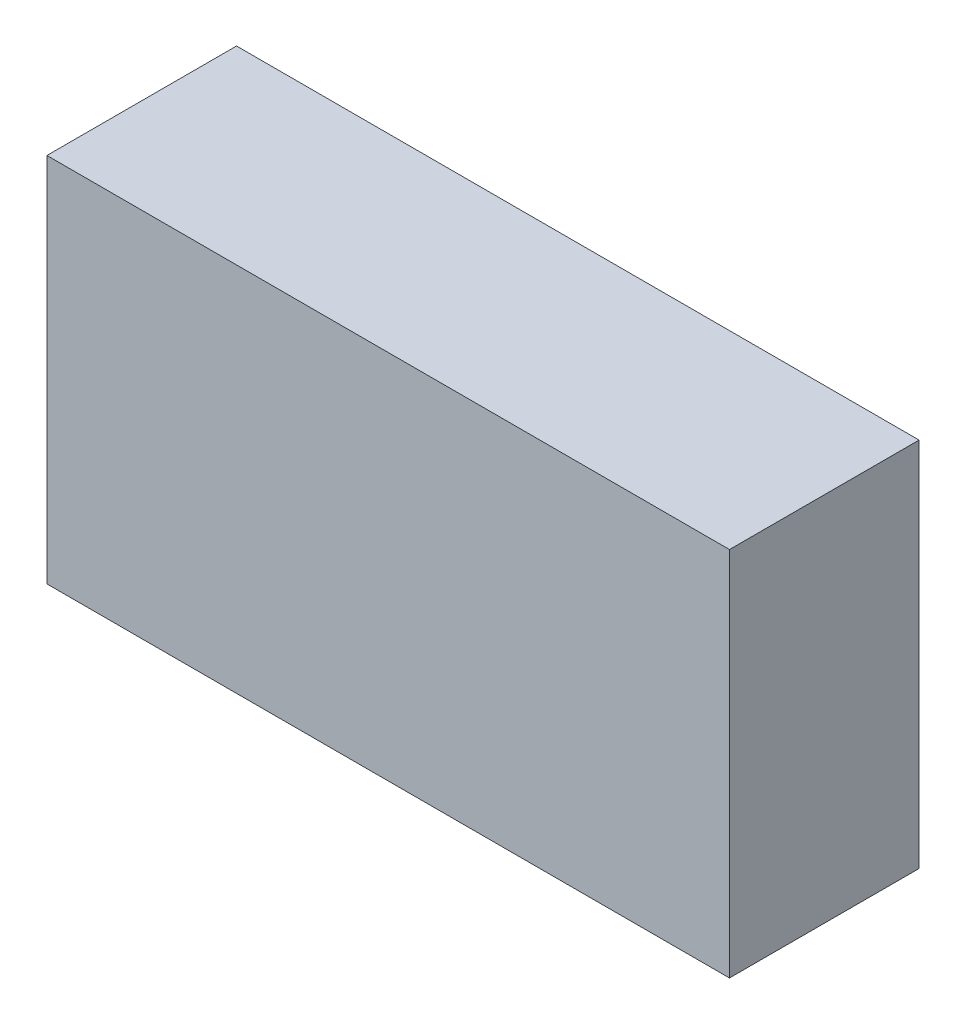
ISO-10303-21;
HEADER;
FILE_DESCRIPTION(('STEP AP214'),'2;1');
FILE_NAME('part.step','',(''),(''),'','','');
FILE_SCHEMA(('AUTOMOTIVE_DESIGN { 1 0 10303 214 1 1 1 1 }'));
ENDSEC;
DATA;
#1=APPLICATION_CONTEXT('core data for automotive mechanical design processes');
#2=APPLICATION_PROTOCOL_DEFINITION('international standard','automotive_design',2000,#1);
#3=PRODUCT_CONTEXT('',#1,'mechanical');
#4=PRODUCT('Part','Part','',(#3));
#5=PRODUCT_RELATED_PRODUCT_CATEGORY('part','',(#4));
#6=PRODUCT_DEFINITION_FORMATION('','',#4);
#7=PRODUCT_DEFINITION_CONTEXT('part definition',#1,'design');
#8=PRODUCT_DEFINITION('design','',#6,#7);
#9=PRODUCT_DEFINITION_SHAPE('','',#8);
#10=(LENGTH_UNIT() NAMED_UNIT(*) SI_UNIT(.MILLI.,.METRE.));
#11=(NAMED_UNIT(*) PLANE_ANGLE_UNIT() SI_UNIT($,.RADIAN.));
#12=(NAMED_UNIT(*) SI_UNIT($,.STERADIAN.) SOLID_ANGLE_UNIT());
#13=UNCERTAINTY_MEASURE_WITH_UNIT(LENGTH_MEASURE(1.E-05),#10,'distance_accuracy_value','');
#14=(GEOMETRIC_REPRESENTATION_CONTEXT(3) GLOBAL_UNCERTAINTY_ASSIGNED_CONTEXT((#13)) GLOBAL_UNIT_ASSIGNED_CONTEXT((#10,
#11,#12)) REPRESENTATION_CONTEXT('',''));
#15=CARTESIAN_POINT('',(0.,0.,0.));
#16=DIRECTION('',(0.,0.,1.));
#17=DIRECTION('',(1.,0.,0.));
#18=AXIS2_PLACEMENT_3D('',#15,#16,#17);
#19=CARTESIAN_POINT('',(3.1496,4.8514,2.032));
#20=DIRECTION('',(0.,0.,-1.));
#21=DIRECTION('',(-1.,0.,0.));
#22=AXIS2_PLACEMENT_3D('',#19,#20,#21);
#23=PLANE('',#22);
#24=DIRECTION('',(0.,1.,0.));
#25=VECTOR('',#24,1.);
#26=CARTESIAN_POINT('',(-3.2512,4.8514,2.032));
#27=LINE('',#26,#25);
#28=CARTESIAN_POINT('',(-3.2512,4.8514,2.032));
#29=VERTEX_POINT('',#28);
#30=CARTESIAN_POINT('',(-3.2512,1.3716,2.032));
#31=VERTEX_POINT('',#30);
#32=EDGE_CURVE('E55',#29,#31,#27,.F.);
#33=ORIENTED_EDGE('',*,*,#32,.T.);
#34=DIRECTION('',(1.,0.,0.));
#35=VECTOR('',#34,1.);
#36=CARTESIAN_POINT('',(-3.2512,1.3716,2.032));
#37=LINE('',#36,#35);
#38=CARTESIAN_POINT('',(3.1496,1.3716,2.032));
#39=VERTEX_POINT('',#38);
#40=EDGE_CURVE('E57',#31,#39,#37,.T.);
#41=ORIENTED_EDGE('',*,*,#40,.T.);
#42=DIRECTION('',(0.,1.,0.));
#43=VECTOR('',#42,1.);
#44=CARTESIAN_POINT('',(3.1496,1.3716,2.032));
#45=LINE('',#44,#43);
#46=CARTESIAN_POINT('',(3.1496,4.8514,2.032));
#47=VERTEX_POINT('',#46);
#48=EDGE_CURVE('E20',#39,#47,#45,.T.);
#49=ORIENTED_EDGE('',*,*,#48,.T.);
#50=DIRECTION('',(1.,0.,0.));
#51=VECTOR('',#50,1.);
#52=CARTESIAN_POINT('',(3.1496,4.8514,2.032));
#53=LINE('',#52,#51);
#54=EDGE_CURVE('E80',#47,#29,#53,.F.);
#55=ORIENTED_EDGE('',*,*,#54,.T.);
#56=EDGE_LOOP('',(#33,#41,#49,#55));
#57=FACE_BOUND('',#56,.T.);
#58=ADVANCED_FACE('F17',(#57),#23,.F.);
#59=CARTESIAN_POINT('',(3.1496,1.3716,0.254));
#60=DIRECTION('',(-1.,0.,0.));
#61=DIRECTION('',(0.,0.,1.));
#62=AXIS2_PLACEMENT_3D('',#59,#60,#61);
#63=PLANE('',#62);
#64=DIRECTION('',(0.,0.,-1.));
#65=VECTOR('',#64,1.);
#66=CARTESIAN_POINT('',(3.1496,4.8514,0.254));
#67=LINE('',#66,#65);
#68=CARTESIAN_POINT('',(3.1496,4.8514,0.254));
#69=VERTEX_POINT('',#68);
#70=EDGE_CURVE('E68',#69,#47,#67,.F.);
#71=ORIENTED_EDGE('',*,*,#70,.T.);
#72=ORIENTED_EDGE('',*,*,#48,.F.);
#73=DIRECTION('',(0.,0.,1.));
#74=VECTOR('',#73,1.);
#75=CARTESIAN_POINT('',(3.1496,1.3716,0.254));
#76=LINE('',#75,#74);
#77=CARTESIAN_POINT('',(3.1496,1.3716,0.254));
#78=VERTEX_POINT('',#77);
#79=EDGE_CURVE('E63',#39,#78,#76,.F.);
#80=ORIENTED_EDGE('',*,*,#79,.T.);
#81=DIRECTION('',(0.,1.,0.));
#82=VECTOR('',#81,1.);
#83=CARTESIAN_POINT('',(3.1496,4.8514,0.254));
#84=LINE('',#83,#82);
#85=EDGE_CURVE('E83',#69,#78,#84,.F.);
#86=ORIENTED_EDGE('',*,*,#85,.F.);
#87=EDGE_LOOP('',(#71,#72,#80,#86));
#88=FACE_BOUND('',#87,.T.);
#89=ADVANCED_FACE('F65',(#88),#63,.F.);
#90=CARTESIAN_POINT('',(-3.2512,1.3716,0.254));
#91=DIRECTION('',(0.,1.,0.));
#92=DIRECTION('',(0.,0.,1.));
#93=AXIS2_PLACEMENT_3D('',#90,#91,#92);
#94=PLANE('',#93);
#95=ORIENTED_EDGE('',*,*,#79,.F.);
#96=ORIENTED_EDGE('',*,*,#40,.F.);
#97=DIRECTION('',(0.,0.,-1.));
#98=VECTOR('',#97,1.);
#99=CARTESIAN_POINT('',(-3.2512,1.3716,0.254));
#100=LINE('',#99,#98);
#101=CARTESIAN_POINT('',(-3.2512,1.3716,0.254));
#102=VERTEX_POINT('',#101);
#103=EDGE_CURVE('E75',#31,#102,#100,.T.);
#104=ORIENTED_EDGE('',*,*,#103,.T.);
#105=DIRECTION('',(-1.,0.,0.));
#106=VECTOR('',#105,1.);
#107=CARTESIAN_POINT('',(3.1496,1.3716,0.254));
#108=LINE('',#107,#106);
#109=EDGE_CURVE('E72',#78,#102,#108,.T.);
#110=ORIENTED_EDGE('',*,*,#109,.F.);
#111=EDGE_LOOP('',(#95,#96,#104,#110));
#112=FACE_BOUND('',#111,.T.);
#113=ADVANCED_FACE('F70',(#112),#94,.F.);
#114=CARTESIAN_POINT('',(-3.2512,4.8514,0.254));
#115=DIRECTION('',(1.,0.,0.));
#116=DIRECTION('',(0.,0.,-1.));
#117=AXIS2_PLACEMENT_3D('',#114,#115,#116);
#118=PLANE('',#117);
#119=ORIENTED_EDGE('',*,*,#103,.F.);
#120=ORIENTED_EDGE('',*,*,#32,.F.);
#121=DIRECTION('',(0.,0.,-1.));
#122=VECTOR('',#121,1.);
#123=CARTESIAN_POINT('',(-3.2512,4.8514,0.254));
#124=LINE('',#123,#122);
#125=CARTESIAN_POINT('',(-3.2512,4.8514,0.254));
#126=VERTEX_POINT('',#125);
#127=EDGE_CURVE('E35',#29,#126,#124,.T.);
#128=ORIENTED_EDGE('',*,*,#127,.T.);
#129=DIRECTION('',(0.,1.,0.));
#130=VECTOR('',#129,1.);
#131=CARTESIAN_POINT('',(-3.2512,4.8514,0.254));
#132=LINE('',#131,#130);
#133=EDGE_CURVE('E26',#102,#126,#132,.T.);
#134=ORIENTED_EDGE('',*,*,#133,.F.);
#135=EDGE_LOOP('',(#119,#120,#128,#134));
#136=FACE_BOUND('',#135,.T.);
#137=ADVANCED_FACE('F89',(#136),#118,.F.);
#138=CARTESIAN_POINT('',(3.1496,4.8514,0.254));
#139=DIRECTION('',(0.,-1.,0.));
#140=DIRECTION('',(0.,0.,-1.));
#141=AXIS2_PLACEMENT_3D('',#138,#139,#140);
#142=PLANE('',#141);
#143=ORIENTED_EDGE('',*,*,#127,.F.);
#144=ORIENTED_EDGE('',*,*,#54,.F.);
#145=ORIENTED_EDGE('',*,*,#70,.F.);
#146=DIRECTION('',(-1.,0.,0.));
#147=VECTOR('',#146,1.);
#148=CARTESIAN_POINT('',(3.1496,4.8514,0.254));
#149=LINE('',#148,#147);
#150=EDGE_CURVE('E11',#126,#69,#149,.F.);
#151=ORIENTED_EDGE('',*,*,#150,.F.);
#152=EDGE_LOOP('',(#143,#144,#145,#151));
#153=FACE_BOUND('',#152,.T.);
#154=ADVANCED_FACE('F91',(#153),#142,.F.);
#155=CARTESIAN_POINT('',(3.1496,4.8514,0.254));
#156=DIRECTION('',(0.,0.,-1.));
#157=DIRECTION('',(-1.,0.,0.));
#158=AXIS2_PLACEMENT_3D('',#155,#156,#157);
#159=PLANE('',#158);
#160=ORIENTED_EDGE('',*,*,#133,.T.);
#161=ORIENTED_EDGE('',*,*,#150,.T.);
#162=ORIENTED_EDGE('',*,*,#85,.T.);
#163=ORIENTED_EDGE('',*,*,#109,.T.);
#164=EDGE_LOOP('',(#160,#161,#162,#163));
#165=FACE_BOUND('',#164,.T.);
#166=ADVANCED_FACE('F88',(#165),#159,.T.);
#167=CLOSED_SHELL('',(#58,#89,#113,#137,#154,#166));
#168=MANIFOLD_SOLID_BREP('B1',#167);
#169=ADVANCED_BREP_SHAPE_REPRESENTATION('',(#18,#168),#14);
#170=SHAPE_DEFINITION_REPRESENTATION(#9,#169);
ENDSEC;
END-ISO-10303-21;
